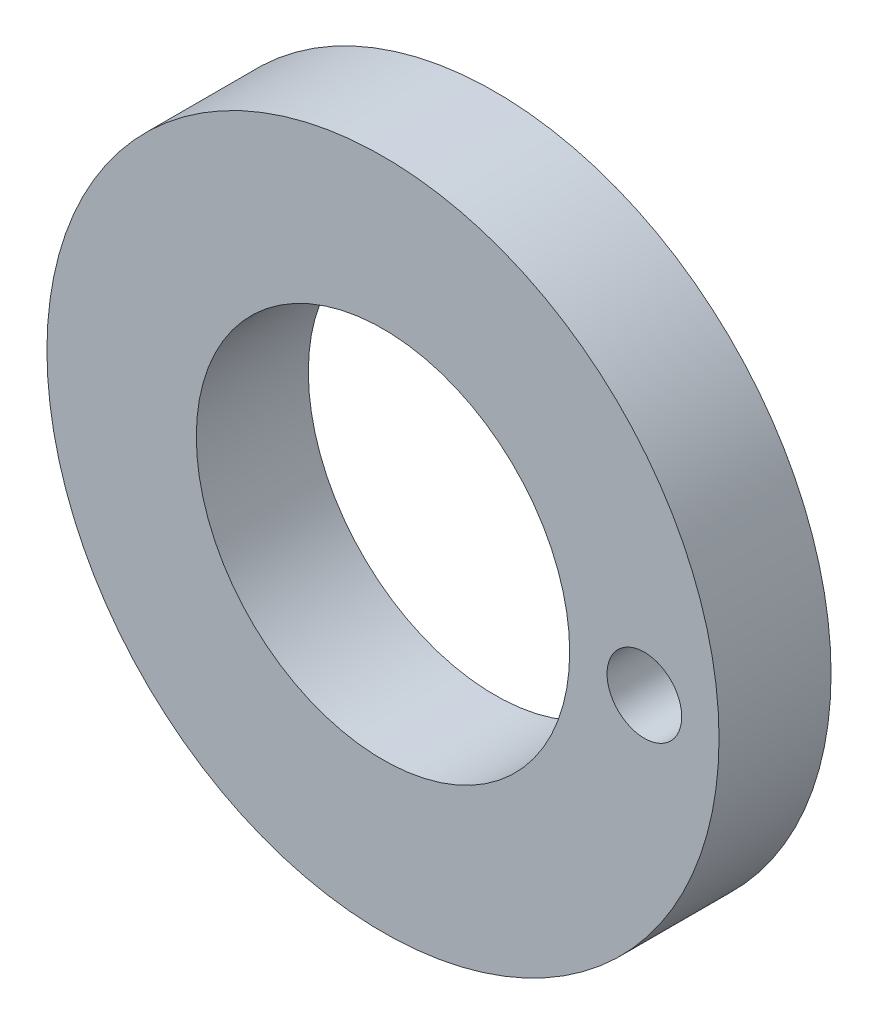
ISO-10303-21;
HEADER;
FILE_DESCRIPTION(('STEP AP214'),'2;1');
FILE_NAME('part.step','',(''),(''),'','','');
FILE_SCHEMA(('AUTOMOTIVE_DESIGN { 1 0 10303 214 1 1 1 1 }'));
ENDSEC;
DATA;
#1=APPLICATION_CONTEXT('core data for automotive mechanical design processes');
#2=APPLICATION_PROTOCOL_DEFINITION('international standard','automotive_design',2000,#1);
#3=PRODUCT_CONTEXT('',#1,'mechanical');
#4=PRODUCT('Part','Part','',(#3));
#5=PRODUCT_RELATED_PRODUCT_CATEGORY('part','',(#4));
#6=PRODUCT_DEFINITION_FORMATION('','',#4);
#7=PRODUCT_DEFINITION_CONTEXT('part definition',#1,'design');
#8=PRODUCT_DEFINITION('design','',#6,#7);
#9=PRODUCT_DEFINITION_SHAPE('','',#8);
#10=(LENGTH_UNIT() NAMED_UNIT(*) SI_UNIT(.MILLI.,.METRE.));
#11=(NAMED_UNIT(*) PLANE_ANGLE_UNIT() SI_UNIT($,.RADIAN.));
#12=(NAMED_UNIT(*) SI_UNIT($,.STERADIAN.) SOLID_ANGLE_UNIT());
#13=UNCERTAINTY_MEASURE_WITH_UNIT(LENGTH_MEASURE(1.E-05),#10,'distance_accuracy_value','');
#14=(GEOMETRIC_REPRESENTATION_CONTEXT(3) GLOBAL_UNCERTAINTY_ASSIGNED_CONTEXT((#13)) GLOBAL_UNIT_ASSIGNED_CONTEXT((#10,
#11,#12)) REPRESENTATION_CONTEXT('',''));
#15=CARTESIAN_POINT('',(0.,0.,0.));
#16=DIRECTION('',(0.,0.,1.));
#17=DIRECTION('',(1.,0.,0.));
#18=AXIS2_PLACEMENT_3D('',#15,#16,#17);
#19=CARTESIAN_POINT('',(0.,0.,30.));
#20=DIRECTION('',(0.,0.,-1.));
#21=DIRECTION('',(-1.,0.,0.));
#22=AXIS2_PLACEMENT_3D('',#19,#20,#21);
#23=CYLINDRICAL_SURFACE('',#22,90.);
#24=CARTESIAN_POINT('',(0.,0.,30.));
#25=DIRECTION('',(0.,0.,1.));
#26=DIRECTION('',(1.,0.,0.));
#27=AXIS2_PLACEMENT_3D('',#24,#25,#26);
#28=CIRCLE('',#27,90.);
#29=CARTESIAN_POINT('',(90.,0.,30.));
#30=VERTEX_POINT('',#29);
#31=EDGE_CURVE('E10',#30,#30,#28,.T.);
#32=ORIENTED_EDGE('',*,*,#31,.F.);
#33=EDGE_LOOP('',(#32));
#34=FACE_BOUND('',#33,.T.);
#35=CARTESIAN_POINT('',(0.,0.,0.));
#36=DIRECTION('',(0.,0.,1.));
#37=DIRECTION('',(1.,0.,0.));
#38=AXIS2_PLACEMENT_3D('',#35,#36,#37);
#39=CIRCLE('',#38,90.);
#40=CARTESIAN_POINT('',(90.,0.,0.));
#41=VERTEX_POINT('',#40);
#42=EDGE_CURVE('E45',#41,#41,#39,.T.);
#43=ORIENTED_EDGE('',*,*,#42,.T.);
#44=EDGE_LOOP('',(#43));
#45=FACE_BOUND('',#44,.T.);
#46=ADVANCED_FACE('F37',(#34,#45),#23,.T.);
#47=CARTESIAN_POINT('',(0.,0.,30.));
#48=DIRECTION('',(0.,0.,1.));
#49=DIRECTION('',(1.,0.,0.));
#50=AXIS2_PLACEMENT_3D('',#47,#48,#49);
#51=PLANE('',#50);
#52=CARTESIAN_POINT('',(70.0000000000001,0.,30.));
#53=DIRECTION('',(0.,0.,1.));
#54=DIRECTION('',(1.,0.,0.));
#55=AXIS2_PLACEMENT_3D('',#52,#53,#54);
#56=CIRCLE('',#55,9.99999999999998);
#57=CARTESIAN_POINT('',(80.,0.,30.));
#58=VERTEX_POINT('',#57);
#59=EDGE_CURVE('E60',#58,#58,#56,.T.);
#60=ORIENTED_EDGE('',*,*,#59,.F.);
#61=EDGE_LOOP('',(#60));
#62=FACE_BOUND('',#61,.T.);
#63=CARTESIAN_POINT('',(0.,0.,30.));
#64=DIRECTION('',(0.,0.,1.));
#65=DIRECTION('',(1.,0.,0.));
#66=AXIS2_PLACEMENT_3D('',#63,#64,#65);
#67=CIRCLE('',#66,50.);
#68=CARTESIAN_POINT('',(50.,0.,30.));
#69=VERTEX_POINT('',#68);
#70=EDGE_CURVE('E51',#69,#69,#67,.F.);
#71=ORIENTED_EDGE('',*,*,#70,.T.);
#72=EDGE_LOOP('',(#71));
#73=FACE_BOUND('',#72,.T.);
#74=ORIENTED_EDGE('',*,*,#31,.T.);
#75=EDGE_LOOP('',(#74));
#76=FACE_BOUND('',#75,.T.);
#77=ADVANCED_FACE('F82',(#62,#73,#76),#51,.T.);
#78=CARTESIAN_POINT('',(0.,0.,0.));
#79=DIRECTION('',(0.,0.,1.));
#80=DIRECTION('',(1.,0.,0.));
#81=AXIS2_PLACEMENT_3D('',#78,#79,#80);
#82=PLANE('',#81);
#83=CARTESIAN_POINT('',(70.0000000000001,0.,0.));
#84=DIRECTION('',(0.,0.,1.));
#85=DIRECTION('',(1.,0.,0.));
#86=AXIS2_PLACEMENT_3D('',#83,#84,#85);
#87=CIRCLE('',#86,9.99999999999998);
#88=CARTESIAN_POINT('',(80.,0.,0.));
#89=VERTEX_POINT('',#88);
#90=EDGE_CURVE('E40',#89,#89,#87,.T.);
#91=ORIENTED_EDGE('',*,*,#90,.T.);
#92=EDGE_LOOP('',(#91));
#93=FACE_BOUND('',#92,.T.);
#94=CARTESIAN_POINT('',(0.,0.,0.));
#95=DIRECTION('',(0.,0.,1.));
#96=DIRECTION('',(1.,0.,0.));
#97=AXIS2_PLACEMENT_3D('',#94,#95,#96);
#98=CIRCLE('',#97,50.);
#99=CARTESIAN_POINT('',(50.,0.,0.));
#100=VERTEX_POINT('',#99);
#101=EDGE_CURVE('E56',#100,#100,#98,.T.);
#102=ORIENTED_EDGE('',*,*,#101,.T.);
#103=EDGE_LOOP('',(#102));
#104=FACE_BOUND('',#103,.T.);
#105=ORIENTED_EDGE('',*,*,#42,.F.);
#106=EDGE_LOOP('',(#105));
#107=FACE_BOUND('',#106,.T.);
#108=ADVANCED_FACE('F69',(#93,#104,#107),#82,.F.);
#109=CARTESIAN_POINT('',(0.,0.,70.));
#110=DIRECTION('',(0.,0.,-1.));
#111=DIRECTION('',(-1.,0.,0.));
#112=AXIS2_PLACEMENT_3D('',#109,#110,#111);
#113=CYLINDRICAL_SURFACE('',#112,50.);
#114=ORIENTED_EDGE('',*,*,#70,.F.);
#115=EDGE_LOOP('',(#114));
#116=FACE_BOUND('',#115,.T.);
#117=ORIENTED_EDGE('',*,*,#101,.F.);
#118=EDGE_LOOP('',(#117));
#119=FACE_BOUND('',#118,.T.);
#120=ADVANCED_FACE('F74',(#116,#119),#113,.F.);
#121=CARTESIAN_POINT('',(70.0000000000001,0.,-40.));
#122=DIRECTION('',(0.,0.,1.));
#123=DIRECTION('',(1.,0.,0.));
#124=AXIS2_PLACEMENT_3D('',#121,#122,#123);
#125=CYLINDRICAL_SURFACE('',#124,9.99999999999998);
#126=ORIENTED_EDGE('',*,*,#59,.T.);
#127=EDGE_LOOP('',(#126));
#128=FACE_BOUND('',#127,.T.);
#129=ORIENTED_EDGE('',*,*,#90,.F.);
#130=EDGE_LOOP('',(#129));
#131=FACE_BOUND('',#130,.T.);
#132=ADVANCED_FACE('F72',(#128,#131),#125,.F.);
#133=CLOSED_SHELL('',(#46,#77,#108,#120,#132));
#134=MANIFOLD_SOLID_BREP('B2',#133);
#135=ADVANCED_BREP_SHAPE_REPRESENTATION('',(#18,#134),#14);
#136=SHAPE_DEFINITION_REPRESENTATION(#9,#135);
ENDSEC;
END-ISO-10303-21;
